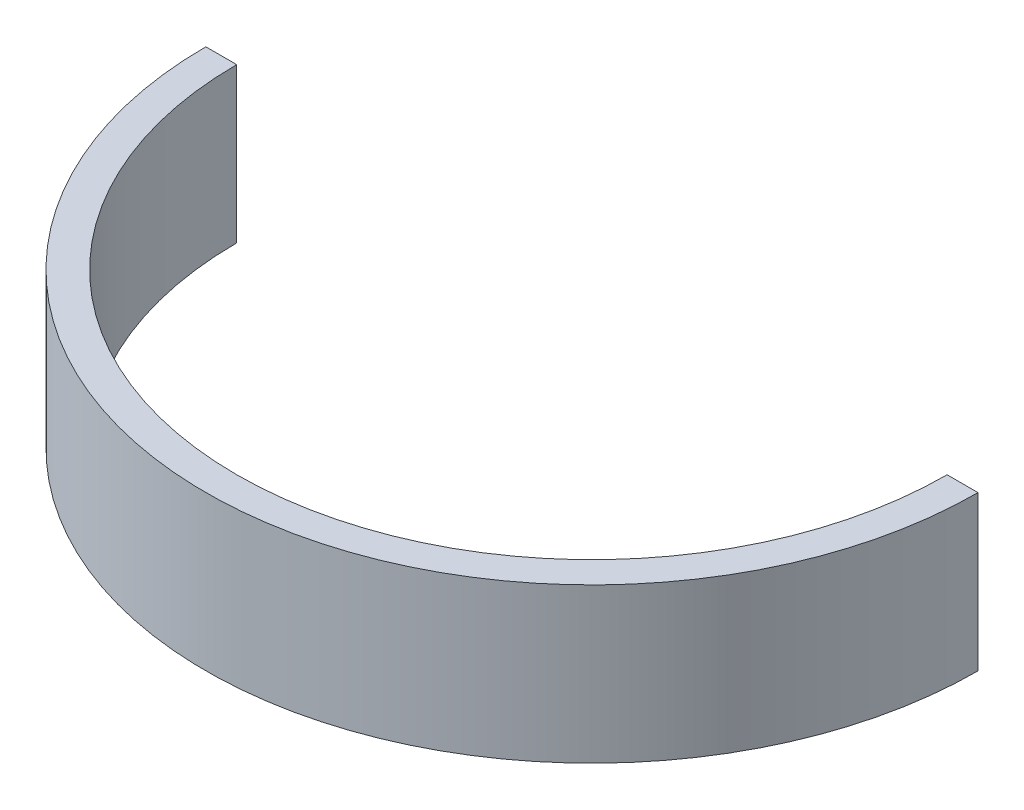
ISO-10303-21;
HEADER;
FILE_DESCRIPTION(('STEP AP214'),'2;1');
FILE_NAME('part.step','',(''),(''),'','','');
FILE_SCHEMA(('AUTOMOTIVE_DESIGN { 1 0 10303 214 1 1 1 1 }'));
ENDSEC;
DATA;
#1=APPLICATION_CONTEXT('core data for automotive mechanical design processes');
#2=APPLICATION_PROTOCOL_DEFINITION('international standard','automotive_design',2000,#1);
#3=PRODUCT_CONTEXT('',#1,'mechanical');
#4=PRODUCT('Part','Part','',(#3));
#5=PRODUCT_RELATED_PRODUCT_CATEGORY('part','',(#4));
#6=PRODUCT_DEFINITION_FORMATION('','',#4);
#7=PRODUCT_DEFINITION_CONTEXT('part definition',#1,'design');
#8=PRODUCT_DEFINITION('design','',#6,#7);
#9=PRODUCT_DEFINITION_SHAPE('','',#8);
#10=(LENGTH_UNIT() NAMED_UNIT(*) SI_UNIT(.MILLI.,.METRE.));
#11=(NAMED_UNIT(*) PLANE_ANGLE_UNIT() SI_UNIT($,.RADIAN.));
#12=(NAMED_UNIT(*) SI_UNIT($,.STERADIAN.) SOLID_ANGLE_UNIT());
#13=UNCERTAINTY_MEASURE_WITH_UNIT(LENGTH_MEASURE(1.E-05),#10,'distance_accuracy_value','');
#14=(GEOMETRIC_REPRESENTATION_CONTEXT(3) GLOBAL_UNCERTAINTY_ASSIGNED_CONTEXT((#13)) GLOBAL_UNIT_ASSIGNED_CONTEXT((#10,
#11,#12)) REPRESENTATION_CONTEXT('',''));
#15=CARTESIAN_POINT('',(0.,0.,0.));
#16=DIRECTION('',(0.,0.,1.));
#17=DIRECTION('',(1.,0.,0.));
#18=AXIS2_PLACEMENT_3D('',#15,#16,#17);
#19=CARTESIAN_POINT('',(0.,20.,0.));
#20=DIRECTION('',(0.,-1.,0.));
#21=DIRECTION('',(0.,0.,-1.));
#22=AXIS2_PLACEMENT_3D('',#19,#20,#21);
#23=CYLINDRICAL_SURFACE('',#22,46.);
#24=CARTESIAN_POINT('',(0.,0.,0.));
#25=DIRECTION('',(0.,-1.,0.));
#26=DIRECTION('',(0.,0.,1.));
#27=AXIS2_PLACEMENT_3D('',#24,#25,#26);
#28=CIRCLE('',#27,46.);
#29=CARTESIAN_POINT('',(46.,0.,0.));
#30=VERTEX_POINT('',#29);
#31=CARTESIAN_POINT('',(-46.,0.,0.));
#32=VERTEX_POINT('',#31);
#33=EDGE_CURVE('E107',#30,#32,#28,.T.);
#34=ORIENTED_EDGE('',*,*,#33,.T.);
#35=DIRECTION('',(0.,-1.,0.));
#36=VECTOR('',#35,1.);
#37=CARTESIAN_POINT('',(-46.,20.,0.));
#38=LINE('',#37,#36);
#39=CARTESIAN_POINT('',(-46.,20.,0.));
#40=VERTEX_POINT('',#39);
#41=EDGE_CURVE('E11',#40,#32,#38,.T.);
#42=ORIENTED_EDGE('',*,*,#41,.F.);
#43=CARTESIAN_POINT('',(0.,20.,0.));
#44=DIRECTION('',(0.,-1.,0.));
#45=DIRECTION('',(0.,0.,1.));
#46=AXIS2_PLACEMENT_3D('',#43,#44,#45);
#47=CIRCLE('',#46,46.);
#48=CARTESIAN_POINT('',(46.,20.,0.));
#49=VERTEX_POINT('',#48);
#50=EDGE_CURVE('E91',#49,#40,#47,.T.);
#51=ORIENTED_EDGE('',*,*,#50,.F.);
#52=DIRECTION('',(0.,-1.,0.));
#53=VECTOR('',#52,1.);
#54=CARTESIAN_POINT('',(46.,20.,0.));
#55=LINE('',#54,#53);
#56=EDGE_CURVE('E103',#49,#30,#55,.T.);
#57=ORIENTED_EDGE('',*,*,#56,.T.);
#58=EDGE_LOOP('',(#34,#42,#51,#57));
#59=FACE_BOUND('',#58,.T.);
#60=ADVANCED_FACE('F39',(#59),#23,.F.);
#61=CARTESIAN_POINT('',(-50.,20.,0.));
#62=DIRECTION('',(0.,0.,1.));
#63=DIRECTION('',(1.,0.,0.));
#64=AXIS2_PLACEMENT_3D('',#61,#62,#63);
#65=PLANE('',#64);
#66=DIRECTION('',(-1.,0.,0.));
#67=VECTOR('',#66,1.);
#68=CARTESIAN_POINT('',(-50.,0.,0.));
#69=LINE('',#68,#67);
#70=CARTESIAN_POINT('',(-50.,0.,0.));
#71=VERTEX_POINT('',#70);
#72=EDGE_CURVE('E96',#32,#71,#69,.T.);
#73=ORIENTED_EDGE('',*,*,#72,.T.);
#74=DIRECTION('',(0.,-1.,0.));
#75=VECTOR('',#74,1.);
#76=CARTESIAN_POINT('',(-50.,20.,0.));
#77=LINE('',#76,#75);
#78=CARTESIAN_POINT('',(-50.,20.,0.));
#79=VERTEX_POINT('',#78);
#80=EDGE_CURVE('E48',#79,#71,#77,.T.);
#81=ORIENTED_EDGE('',*,*,#80,.F.);
#82=DIRECTION('',(-1.,0.,0.));
#83=VECTOR('',#82,1.);
#84=CARTESIAN_POINT('',(-50.,20.,0.));
#85=LINE('',#84,#83);
#86=EDGE_CURVE('E86',#40,#79,#85,.T.);
#87=ORIENTED_EDGE('',*,*,#86,.F.);
#88=ORIENTED_EDGE('',*,*,#41,.T.);
#89=EDGE_LOOP('',(#73,#81,#87,#88));
#90=FACE_BOUND('',#89,.T.);
#91=ADVANCED_FACE('F95',(#90),#65,.F.);
#92=CARTESIAN_POINT('',(0.,20.,0.));
#93=DIRECTION('',(0.,-1.,0.));
#94=DIRECTION('',(0.,0.,-1.));
#95=AXIS2_PLACEMENT_3D('',#92,#93,#94);
#96=CYLINDRICAL_SURFACE('',#95,50.);
#97=CARTESIAN_POINT('',(0.,0.,0.));
#98=DIRECTION('',(0.,1.,0.));
#99=DIRECTION('',(0.,0.,1.));
#100=AXIS2_PLACEMENT_3D('',#97,#98,#99);
#101=CIRCLE('',#100,50.);
#102=CARTESIAN_POINT('',(50.,0.,0.));
#103=VERTEX_POINT('',#102);
#104=EDGE_CURVE('E73',#71,#103,#101,.T.);
#105=ORIENTED_EDGE('',*,*,#104,.T.);
#106=DIRECTION('',(0.,-1.,0.));
#107=VECTOR('',#106,1.);
#108=CARTESIAN_POINT('',(50.,20.,0.));
#109=LINE('',#108,#107);
#110=CARTESIAN_POINT('',(50.,20.,0.));
#111=VERTEX_POINT('',#110);
#112=EDGE_CURVE('E98',#111,#103,#109,.T.);
#113=ORIENTED_EDGE('',*,*,#112,.F.);
#114=CARTESIAN_POINT('',(0.,20.,0.));
#115=DIRECTION('',(0.,1.,0.));
#116=DIRECTION('',(0.,0.,1.));
#117=AXIS2_PLACEMENT_3D('',#114,#115,#116);
#118=CIRCLE('',#117,50.);
#119=EDGE_CURVE('E89',#79,#111,#118,.T.);
#120=ORIENTED_EDGE('',*,*,#119,.F.);
#121=ORIENTED_EDGE('',*,*,#80,.T.);
#122=EDGE_LOOP('',(#105,#113,#120,#121));
#123=FACE_BOUND('',#122,.T.);
#124=ADVANCED_FACE('F99',(#123),#96,.T.);
#125=CARTESIAN_POINT('',(46.,20.,0.));
#126=DIRECTION('',(0.,0.,1.));
#127=DIRECTION('',(1.,0.,0.));
#128=AXIS2_PLACEMENT_3D('',#125,#126,#127);
#129=PLANE('',#128);
#130=DIRECTION('',(-1.,0.,0.));
#131=VECTOR('',#130,1.);
#132=CARTESIAN_POINT('',(46.,0.,0.));
#133=LINE('',#132,#131);
#134=EDGE_CURVE('E79',#103,#30,#133,.T.);
#135=ORIENTED_EDGE('',*,*,#134,.T.);
#136=ORIENTED_EDGE('',*,*,#56,.F.);
#137=DIRECTION('',(-1.,0.,0.));
#138=VECTOR('',#137,1.);
#139=CARTESIAN_POINT('',(46.,20.,0.));
#140=LINE('',#139,#138);
#141=EDGE_CURVE('E56',#111,#49,#140,.T.);
#142=ORIENTED_EDGE('',*,*,#141,.F.);
#143=ORIENTED_EDGE('',*,*,#112,.T.);
#144=EDGE_LOOP('',(#135,#136,#142,#143));
#145=FACE_BOUND('',#144,.T.);
#146=ADVANCED_FACE('F120',(#145),#129,.F.);
#147=CARTESIAN_POINT('',(0.,20.,0.));
#148=DIRECTION('',(0.,1.,0.));
#149=DIRECTION('',(0.,0.,1.));
#150=AXIS2_PLACEMENT_3D('',#147,#148,#149);
#151=PLANE('',#150);
#152=ORIENTED_EDGE('',*,*,#50,.T.);
#153=ORIENTED_EDGE('',*,*,#86,.T.);
#154=ORIENTED_EDGE('',*,*,#119,.T.);
#155=ORIENTED_EDGE('',*,*,#141,.T.);
#156=EDGE_LOOP('',(#152,#153,#154,#155));
#157=FACE_BOUND('',#156,.T.);
#158=ADVANCED_FACE('F87',(#157),#151,.T.);
#159=CARTESIAN_POINT('',(0.,0.,0.));
#160=DIRECTION('',(0.,1.,0.));
#161=DIRECTION('',(0.,0.,1.));
#162=AXIS2_PLACEMENT_3D('',#159,#160,#161);
#163=PLANE('',#162);
#164=ORIENTED_EDGE('',*,*,#33,.F.);
#165=ORIENTED_EDGE('',*,*,#134,.F.);
#166=ORIENTED_EDGE('',*,*,#104,.F.);
#167=ORIENTED_EDGE('',*,*,#72,.F.);
#168=EDGE_LOOP('',(#164,#165,#166,#167));
#169=FACE_BOUND('',#168,.T.);
#170=ADVANCED_FACE('F123',(#169),#163,.F.);
#171=CLOSED_SHELL('',(#60,#91,#124,#146,#158,#170));
#172=MANIFOLD_SOLID_BREP('B2',#171);
#173=ADVANCED_BREP_SHAPE_REPRESENTATION('',(#18,#172),#14);
#174=SHAPE_DEFINITION_REPRESENTATION(#9,#173);
ENDSEC;
END-ISO-10303-21;
